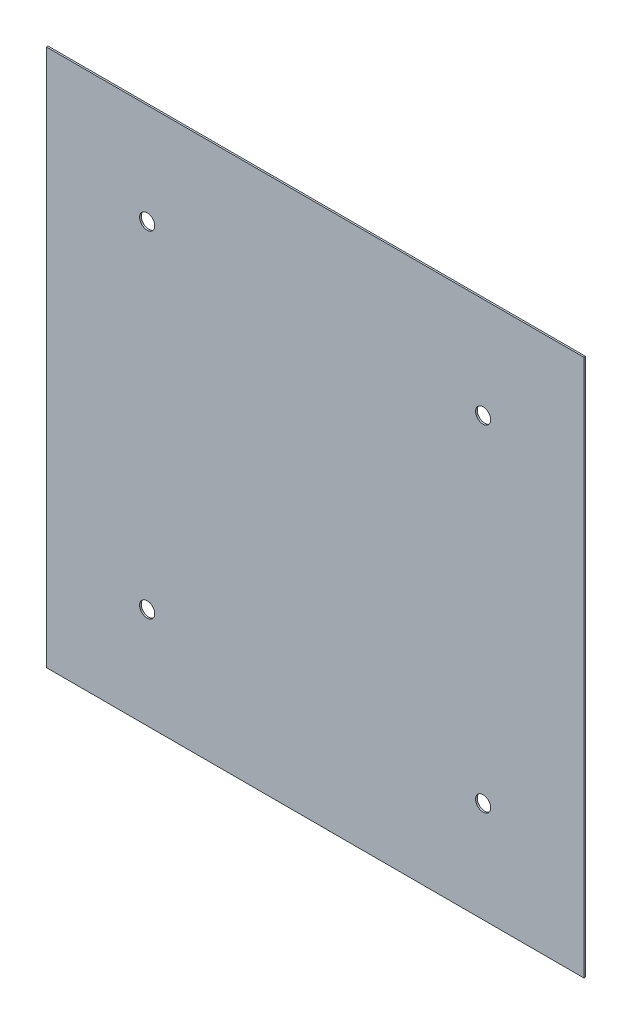
ISO-10303-21;
HEADER;
FILE_DESCRIPTION(('STEP AP214'),'2;1');
FILE_NAME('part.step','',(''),(''),'','','');
FILE_SCHEMA(('AUTOMOTIVE_DESIGN { 1 0 10303 214 1 1 1 1 }'));
ENDSEC;
DATA;
#1=APPLICATION_CONTEXT('core data for automotive mechanical design processes');
#2=APPLICATION_PROTOCOL_DEFINITION('international standard','automotive_design',2000,#1);
#3=PRODUCT_CONTEXT('',#1,'mechanical');
#4=PRODUCT('Part','Part','',(#3));
#5=PRODUCT_RELATED_PRODUCT_CATEGORY('part','',(#4));
#6=PRODUCT_DEFINITION_FORMATION('','',#4);
#7=PRODUCT_DEFINITION_CONTEXT('part definition',#1,'design');
#8=PRODUCT_DEFINITION('design','',#6,#7);
#9=PRODUCT_DEFINITION_SHAPE('','',#8);
#10=(LENGTH_UNIT() NAMED_UNIT(*) SI_UNIT(.MILLI.,.METRE.));
#11=(NAMED_UNIT(*) PLANE_ANGLE_UNIT() SI_UNIT($,.RADIAN.));
#12=(NAMED_UNIT(*) SI_UNIT($,.STERADIAN.) SOLID_ANGLE_UNIT());
#13=UNCERTAINTY_MEASURE_WITH_UNIT(LENGTH_MEASURE(1.E-05),#10,'distance_accuracy_value','');
#14=(GEOMETRIC_REPRESENTATION_CONTEXT(3) GLOBAL_UNCERTAINTY_ASSIGNED_CONTEXT((#13)) GLOBAL_UNIT_ASSIGNED_CONTEXT((#10,
#11,#12)) REPRESENTATION_CONTEXT('',''));
#15=CARTESIAN_POINT('',(0.,0.,0.));
#16=DIRECTION('',(0.,0.,1.));
#17=DIRECTION('',(1.,0.,0.));
#18=AXIS2_PLACEMENT_3D('',#15,#16,#17);
#19=CARTESIAN_POINT('',(0.,0.,108.5));
#20=DIRECTION('',(0.,0.,1.));
#21=DIRECTION('',(1.,0.,0.));
#22=AXIS2_PLACEMENT_3D('',#19,#20,#21);
#23=PLANE('',#22);
#24=CARTESIAN_POINT('',(50.,50.,108.5));
#25=DIRECTION('',(0.,0.,1.));
#26=DIRECTION('',(1.,0.,0.));
#27=AXIS2_PLACEMENT_3D('',#24,#25,#26);
#28=CIRCLE('',#27,2.25);
#29=CARTESIAN_POINT('',(52.25,50.,108.5));
#30=VERTEX_POINT('',#29);
#31=EDGE_CURVE('E119',#30,#30,#28,.T.);
#32=ORIENTED_EDGE('',*,*,#31,.F.);
#33=EDGE_LOOP('',(#32));
#34=FACE_BOUND('',#33,.T.);
#35=CARTESIAN_POINT('',(50.,-50.,108.5));
#36=DIRECTION('',(0.,0.,1.));
#37=DIRECTION('',(1.,0.,0.));
#38=AXIS2_PLACEMENT_3D('',#35,#36,#37);
#39=CIRCLE('',#38,2.25);
#40=CARTESIAN_POINT('',(52.25,-50.,108.5));
#41=VERTEX_POINT('',#40);
#42=EDGE_CURVE('E115',#41,#41,#39,.T.);
#43=ORIENTED_EDGE('',*,*,#42,.F.);
#44=EDGE_LOOP('',(#43));
#45=FACE_BOUND('',#44,.T.);
#46=CARTESIAN_POINT('',(-50.,50.,108.5));
#47=DIRECTION('',(0.,0.,1.));
#48=DIRECTION('',(1.,0.,0.));
#49=AXIS2_PLACEMENT_3D('',#46,#47,#48);
#50=CIRCLE('',#49,2.25);
#51=CARTESIAN_POINT('',(-47.75,50.,108.5));
#52=VERTEX_POINT('',#51);
#53=EDGE_CURVE('E111',#52,#52,#50,.T.);
#54=ORIENTED_EDGE('',*,*,#53,.F.);
#55=EDGE_LOOP('',(#54));
#56=FACE_BOUND('',#55,.T.);
#57=CARTESIAN_POINT('',(-50.,-50.,108.5));
#58=DIRECTION('',(0.,0.,1.));
#59=DIRECTION('',(1.,0.,0.));
#60=AXIS2_PLACEMENT_3D('',#57,#58,#59);
#61=CIRCLE('',#60,2.25);
#62=CARTESIAN_POINT('',(-47.75,-50.,108.5));
#63=VERTEX_POINT('',#62);
#64=EDGE_CURVE('E76',#63,#63,#61,.T.);
#65=ORIENTED_EDGE('',*,*,#64,.F.);
#66=EDGE_LOOP('',(#65));
#67=FACE_BOUND('',#66,.T.);
#68=DIRECTION('',(-1.,0.,0.));
#69=VECTOR('',#68,1.);
#70=CARTESIAN_POINT('',(0.,-80.,108.5));
#71=LINE('',#70,#69);
#72=CARTESIAN_POINT('',(80.,-80.,108.5));
#73=VERTEX_POINT('',#72);
#74=CARTESIAN_POINT('',(-80.,-80.,108.5));
#75=VERTEX_POINT('',#74);
#76=EDGE_CURVE('E10',#73,#75,#71,.T.);
#77=ORIENTED_EDGE('',*,*,#76,.F.);
#78=DIRECTION('',(0.,-1.,0.));
#79=VECTOR('',#78,1.);
#80=CARTESIAN_POINT('',(80.,0.,108.5));
#81=LINE('',#80,#79);
#82=CARTESIAN_POINT('',(80.,80.,108.5));
#83=VERTEX_POINT('',#82);
#84=EDGE_CURVE('E63',#83,#73,#81,.T.);
#85=ORIENTED_EDGE('',*,*,#84,.F.);
#86=DIRECTION('',(1.,0.,0.));
#87=VECTOR('',#86,1.);
#88=CARTESIAN_POINT('',(0.,80.,108.5));
#89=LINE('',#88,#87);
#90=CARTESIAN_POINT('',(-80.,80.,108.5));
#91=VERTEX_POINT('',#90);
#92=EDGE_CURVE('E102',#91,#83,#89,.T.);
#93=ORIENTED_EDGE('',*,*,#92,.F.);
#94=DIRECTION('',(0.,1.,0.));
#95=VECTOR('',#94,1.);
#96=CARTESIAN_POINT('',(-80.,0.,108.5));
#97=LINE('',#96,#95);
#98=EDGE_CURVE('E25',#75,#91,#97,.T.);
#99=ORIENTED_EDGE('',*,*,#98,.F.);
#100=EDGE_LOOP('',(#77,#85,#93,#99));
#101=FACE_BOUND('',#100,.T.);
#102=ADVANCED_FACE('F16',(#34,#45,#56,#67,#101),#23,.T.);
#103=CARTESIAN_POINT('',(0.,-80.,108.));
#104=DIRECTION('',(0.,-1.,0.));
#105=DIRECTION('',(0.,0.,-1.));
#106=AXIS2_PLACEMENT_3D('',#103,#104,#105);
#107=PLANE('',#106);
#108=DIRECTION('',(0.,0.,1.));
#109=VECTOR('',#108,1.);
#110=CARTESIAN_POINT('',(80.,-80.,108.));
#111=LINE('',#110,#109);
#112=CARTESIAN_POINT('',(80.,-80.,108.));
#113=VERTEX_POINT('',#112);
#114=EDGE_CURVE('E56',#113,#73,#111,.T.);
#115=ORIENTED_EDGE('',*,*,#114,.T.);
#116=ORIENTED_EDGE('',*,*,#76,.T.);
#117=DIRECTION('',(0.,0.,1.));
#118=VECTOR('',#117,1.);
#119=CARTESIAN_POINT('',(-80.,-80.,108.));
#120=LINE('',#119,#118);
#121=CARTESIAN_POINT('',(-80.,-80.,108.));
#122=VERTEX_POINT('',#121);
#123=EDGE_CURVE('E70',#122,#75,#120,.T.);
#124=ORIENTED_EDGE('',*,*,#123,.F.);
#125=DIRECTION('',(1.,0.,0.));
#126=VECTOR('',#125,1.);
#127=CARTESIAN_POINT('',(0.,-80.,108.));
#128=LINE('',#127,#126);
#129=EDGE_CURVE('E68',#122,#113,#128,.T.);
#130=ORIENTED_EDGE('',*,*,#129,.T.);
#131=EDGE_LOOP('',(#115,#116,#124,#130));
#132=FACE_BOUND('',#131,.T.);
#133=ADVANCED_FACE('F69',(#132),#107,.T.);
#134=CARTESIAN_POINT('',(-80.,0.,108.));
#135=DIRECTION('',(-1.,0.,0.));
#136=DIRECTION('',(0.,0.,1.));
#137=AXIS2_PLACEMENT_3D('',#134,#135,#136);
#138=PLANE('',#137);
#139=ORIENTED_EDGE('',*,*,#123,.T.);
#140=ORIENTED_EDGE('',*,*,#98,.T.);
#141=DIRECTION('',(0.,0.,1.));
#142=VECTOR('',#141,1.);
#143=CARTESIAN_POINT('',(-80.,80.,108.));
#144=LINE('',#143,#142);
#145=CARTESIAN_POINT('',(-80.,80.,108.));
#146=VERTEX_POINT('',#145);
#147=EDGE_CURVE('E95',#146,#91,#144,.T.);
#148=ORIENTED_EDGE('',*,*,#147,.F.);
#149=DIRECTION('',(0.,-1.,0.));
#150=VECTOR('',#149,1.);
#151=CARTESIAN_POINT('',(-80.,0.,108.));
#152=LINE('',#151,#150);
#153=EDGE_CURVE('E75',#146,#122,#152,.T.);
#154=ORIENTED_EDGE('',*,*,#153,.T.);
#155=EDGE_LOOP('',(#139,#140,#148,#154));
#156=FACE_BOUND('',#155,.T.);
#157=ADVANCED_FACE('F144',(#156),#138,.T.);
#158=CARTESIAN_POINT('',(0.,80.,108.));
#159=DIRECTION('',(0.,1.,0.));
#160=DIRECTION('',(0.,0.,1.));
#161=AXIS2_PLACEMENT_3D('',#158,#159,#160);
#162=PLANE('',#161);
#163=ORIENTED_EDGE('',*,*,#147,.T.);
#164=ORIENTED_EDGE('',*,*,#92,.T.);
#165=DIRECTION('',(0.,0.,1.));
#166=VECTOR('',#165,1.);
#167=CARTESIAN_POINT('',(80.,80.,108.));
#168=LINE('',#167,#166);
#169=CARTESIAN_POINT('',(80.,80.,108.));
#170=VERTEX_POINT('',#169);
#171=EDGE_CURVE('E65',#170,#83,#168,.T.);
#172=ORIENTED_EDGE('',*,*,#171,.F.);
#173=DIRECTION('',(-1.,0.,0.));
#174=VECTOR('',#173,1.);
#175=CARTESIAN_POINT('',(0.,80.,108.));
#176=LINE('',#175,#174);
#177=EDGE_CURVE('E81',#170,#146,#176,.T.);
#178=ORIENTED_EDGE('',*,*,#177,.T.);
#179=EDGE_LOOP('',(#163,#164,#172,#178));
#180=FACE_BOUND('',#179,.T.);
#181=ADVANCED_FACE('F146',(#180),#162,.T.);
#182=CARTESIAN_POINT('',(0.,0.,108.));
#183=DIRECTION('',(0.,0.,-1.));
#184=DIRECTION('',(-1.,0.,0.));
#185=AXIS2_PLACEMENT_3D('',#182,#183,#184);
#186=PLANE('',#185);
#187=CARTESIAN_POINT('',(50.,50.,108.));
#188=DIRECTION('',(0.,0.,-1.));
#189=DIRECTION('',(-1.,0.,0.));
#190=AXIS2_PLACEMENT_3D('',#187,#188,#189);
#191=CIRCLE('',#190,2.25);
#192=CARTESIAN_POINT('',(47.75,50.,108.));
#193=VERTEX_POINT('',#192);
#194=EDGE_CURVE('E19',#193,#193,#191,.T.);
#195=ORIENTED_EDGE('',*,*,#194,.F.);
#196=EDGE_LOOP('',(#195));
#197=FACE_BOUND('',#196,.T.);
#198=CARTESIAN_POINT('',(50.,-50.,108.));
#199=DIRECTION('',(0.,0.,-1.));
#200=DIRECTION('',(-1.,0.,0.));
#201=AXIS2_PLACEMENT_3D('',#198,#199,#200);
#202=CIRCLE('',#201,2.25);
#203=CARTESIAN_POINT('',(47.75,-50.,108.));
#204=VERTEX_POINT('',#203);
#205=EDGE_CURVE('E116',#204,#204,#202,.T.);
#206=ORIENTED_EDGE('',*,*,#205,.F.);
#207=EDGE_LOOP('',(#206));
#208=FACE_BOUND('',#207,.T.);
#209=CARTESIAN_POINT('',(-50.,50.,108.));
#210=DIRECTION('',(0.,0.,-1.));
#211=DIRECTION('',(-1.,0.,0.));
#212=AXIS2_PLACEMENT_3D('',#209,#210,#211);
#213=CIRCLE('',#212,2.25);
#214=CARTESIAN_POINT('',(-52.25,50.,108.));
#215=VERTEX_POINT('',#214);
#216=EDGE_CURVE('E112',#215,#215,#213,.T.);
#217=ORIENTED_EDGE('',*,*,#216,.F.);
#218=EDGE_LOOP('',(#217));
#219=FACE_BOUND('',#218,.T.);
#220=CARTESIAN_POINT('',(-50.,-50.,108.));
#221=DIRECTION('',(0.,0.,-1.));
#222=DIRECTION('',(-1.,0.,0.));
#223=AXIS2_PLACEMENT_3D('',#220,#221,#222);
#224=CIRCLE('',#223,2.25);
#225=CARTESIAN_POINT('',(-52.25,-50.,108.));
#226=VERTEX_POINT('',#225);
#227=EDGE_CURVE('E107',#226,#226,#224,.T.);
#228=ORIENTED_EDGE('',*,*,#227,.F.);
#229=EDGE_LOOP('',(#228));
#230=FACE_BOUND('',#229,.T.);
#231=DIRECTION('',(0.,1.,0.));
#232=VECTOR('',#231,1.);
#233=CARTESIAN_POINT('',(80.,0.,108.));
#234=LINE('',#233,#232);
#235=EDGE_CURVE('E61',#113,#170,#234,.T.);
#236=ORIENTED_EDGE('',*,*,#235,.F.);
#237=ORIENTED_EDGE('',*,*,#129,.F.);
#238=ORIENTED_EDGE('',*,*,#153,.F.);
#239=ORIENTED_EDGE('',*,*,#177,.F.);
#240=EDGE_LOOP('',(#236,#237,#238,#239));
#241=FACE_BOUND('',#240,.T.);
#242=ADVANCED_FACE('F79',(#197,#208,#219,#230,#241),#186,.T.);
#243=CARTESIAN_POINT('',(80.,0.,108.));
#244=DIRECTION('',(1.,0.,0.));
#245=DIRECTION('',(0.,0.,-1.));
#246=AXIS2_PLACEMENT_3D('',#243,#244,#245);
#247=PLANE('',#246);
#248=ORIENTED_EDGE('',*,*,#235,.T.);
#249=ORIENTED_EDGE('',*,*,#171,.T.);
#250=ORIENTED_EDGE('',*,*,#84,.T.);
#251=ORIENTED_EDGE('',*,*,#114,.F.);
#252=EDGE_LOOP('',(#248,#249,#250,#251));
#253=FACE_BOUND('',#252,.T.);
#254=ADVANCED_FACE('F58',(#253),#247,.T.);
#255=CARTESIAN_POINT('',(-50.,-50.,107.7));
#256=DIRECTION('',(0.,0.,1.));
#257=DIRECTION('',(1.,0.,0.));
#258=AXIS2_PLACEMENT_3D('',#255,#256,#257);
#259=CYLINDRICAL_SURFACE('',#258,2.25);
#260=ORIENTED_EDGE('',*,*,#64,.T.);
#261=EDGE_LOOP('',(#260));
#262=FACE_BOUND('',#261,.T.);
#263=ORIENTED_EDGE('',*,*,#227,.T.);
#264=EDGE_LOOP('',(#263));
#265=FACE_BOUND('',#264,.T.);
#266=ADVANCED_FACE('F138',(#262,#265),#259,.F.);
#267=CARTESIAN_POINT('',(-50.,50.,107.7));
#268=DIRECTION('',(0.,0.,1.));
#269=DIRECTION('',(1.,0.,0.));
#270=AXIS2_PLACEMENT_3D('',#267,#268,#269);
#271=CYLINDRICAL_SURFACE('',#270,2.25);
#272=ORIENTED_EDGE('',*,*,#53,.T.);
#273=EDGE_LOOP('',(#272));
#274=FACE_BOUND('',#273,.T.);
#275=ORIENTED_EDGE('',*,*,#216,.T.);
#276=EDGE_LOOP('',(#275));
#277=FACE_BOUND('',#276,.T.);
#278=ADVANCED_FACE('F197',(#274,#277),#271,.F.);
#279=CARTESIAN_POINT('',(50.,-50.,107.7));
#280=DIRECTION('',(0.,0.,1.));
#281=DIRECTION('',(1.,0.,0.));
#282=AXIS2_PLACEMENT_3D('',#279,#280,#281);
#283=CYLINDRICAL_SURFACE('',#282,2.25);
#284=ORIENTED_EDGE('',*,*,#42,.T.);
#285=EDGE_LOOP('',(#284));
#286=FACE_BOUND('',#285,.T.);
#287=ORIENTED_EDGE('',*,*,#205,.T.);
#288=EDGE_LOOP('',(#287));
#289=FACE_BOUND('',#288,.T.);
#290=ADVANCED_FACE('F206',(#286,#289),#283,.F.);
#291=CARTESIAN_POINT('',(50.,50.,107.7));
#292=DIRECTION('',(0.,0.,1.));
#293=DIRECTION('',(1.,0.,0.));
#294=AXIS2_PLACEMENT_3D('',#291,#292,#293);
#295=CYLINDRICAL_SURFACE('',#294,2.25);
#296=ORIENTED_EDGE('',*,*,#31,.T.);
#297=EDGE_LOOP('',(#296));
#298=FACE_BOUND('',#297,.T.);
#299=ORIENTED_EDGE('',*,*,#194,.T.);
#300=EDGE_LOOP('',(#299));
#301=FACE_BOUND('',#300,.T.);
#302=ADVANCED_FACE('F216',(#298,#301),#295,.F.);
#303=CLOSED_SHELL('',(#102,#133,#157,#181,#242,#254,#266,#278,#290,#302));
#304=MANIFOLD_SOLID_BREP('B1',#303);
#305=ADVANCED_BREP_SHAPE_REPRESENTATION('',(#18,#304),#14);
#306=SHAPE_DEFINITION_REPRESENTATION(#9,#305);
ENDSEC;
END-ISO-10303-21;
